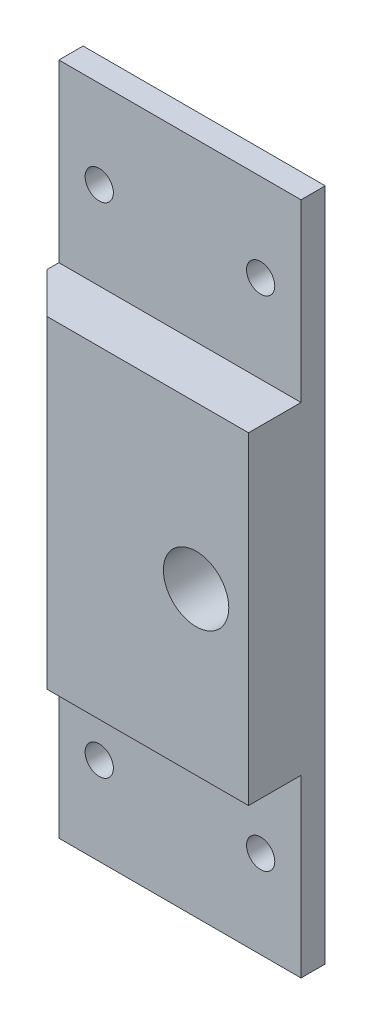
ISO-10303-21;
HEADER;
FILE_DESCRIPTION(('STEP AP214'),'2;1');
FILE_NAME('part.step','',(''),(''),'','','');
FILE_SCHEMA(('AUTOMOTIVE_DESIGN { 1 0 10303 214 1 1 1 1 }'));
ENDSEC;
DATA;
#1=APPLICATION_CONTEXT('core data for automotive mechanical design processes');
#2=APPLICATION_PROTOCOL_DEFINITION('international standard','automotive_design',2000,#1);
#3=PRODUCT_CONTEXT('',#1,'mechanical');
#4=PRODUCT('Part','Part','',(#3));
#5=PRODUCT_RELATED_PRODUCT_CATEGORY('part','',(#4));
#6=PRODUCT_DEFINITION_FORMATION('','',#4);
#7=PRODUCT_DEFINITION_CONTEXT('part definition',#1,'design');
#8=PRODUCT_DEFINITION('design','',#6,#7);
#9=PRODUCT_DEFINITION_SHAPE('','',#8);
#10=(LENGTH_UNIT() NAMED_UNIT(*) SI_UNIT(.MILLI.,.METRE.));
#11=(NAMED_UNIT(*) PLANE_ANGLE_UNIT() SI_UNIT($,.RADIAN.));
#12=(NAMED_UNIT(*) SI_UNIT($,.STERADIAN.) SOLID_ANGLE_UNIT());
#13=UNCERTAINTY_MEASURE_WITH_UNIT(LENGTH_MEASURE(1.E-05),#10,'distance_accuracy_value','');
#14=(GEOMETRIC_REPRESENTATION_CONTEXT(3) GLOBAL_UNCERTAINTY_ASSIGNED_CONTEXT((#13)) GLOBAL_UNIT_ASSIGNED_CONTEXT((#10,
#11,#12)) REPRESENTATION_CONTEXT('',''));
#15=CARTESIAN_POINT('',(0.,0.,0.));
#16=DIRECTION('',(0.,0.,1.));
#17=DIRECTION('',(1.,0.,0.));
#18=AXIS2_PLACEMENT_3D('',#15,#16,#17);
#19=CARTESIAN_POINT('',(0.,0.,3.));
#20=DIRECTION('',(0.,0.,-1.));
#21=DIRECTION('',(-1.,0.,0.));
#22=AXIS2_PLACEMENT_3D('',#19,#20,#21);
#23=PLANE('',#22);
#24=CARTESIAN_POINT('',(25.,72.625,3.));
#25=DIRECTION('',(0.,0.,-1.));
#26=DIRECTION('',(1.,0.,0.));
#27=AXIS2_PLACEMENT_3D('',#24,#25,#26);
#28=CIRCLE('',#27,1.75);
#29=CARTESIAN_POINT('',(26.75,72.625,3.));
#30=VERTEX_POINT('',#29);
#31=EDGE_CURVE('E186',#30,#30,#28,.T.);
#32=ORIENTED_EDGE('',*,*,#31,.T.);
#33=EDGE_LOOP('',(#32));
#34=FACE_BOUND('',#33,.T.);
#35=CARTESIAN_POINT('',(5.,72.625,3.));
#36=DIRECTION('',(0.,0.,-1.));
#37=DIRECTION('',(1.,0.,0.));
#38=AXIS2_PLACEMENT_3D('',#35,#36,#37);
#39=CIRCLE('',#38,1.75);
#40=CARTESIAN_POINT('',(6.75,72.625,3.));
#41=VERTEX_POINT('',#40);
#42=EDGE_CURVE('E182',#41,#41,#39,.T.);
#43=ORIENTED_EDGE('',*,*,#42,.T.);
#44=EDGE_LOOP('',(#43));
#45=FACE_BOUND('',#44,.T.);
#46=DIRECTION('',(-1.,0.,0.));
#47=VECTOR('',#46,1.);
#48=CARTESIAN_POINT('',(0.,61.75,3.));
#49=LINE('',#48,#47);
#50=CARTESIAN_POINT('',(30.,61.75,3.));
#51=VERTEX_POINT('',#50);
#52=CARTESIAN_POINT('',(0.,61.75,3.));
#53=VERTEX_POINT('',#52);
#54=EDGE_CURVE('E110',#51,#53,#49,.T.);
#55=ORIENTED_EDGE('',*,*,#54,.F.);
#56=DIRECTION('',(0.,1.,0.));
#57=VECTOR('',#56,1.);
#58=CARTESIAN_POINT('',(30.,0.,3.));
#59=LINE('',#58,#57);
#60=CARTESIAN_POINT('',(30.,83.5,3.));
#61=VERTEX_POINT('',#60);
#62=EDGE_CURVE('E147',#51,#61,#59,.T.);
#63=ORIENTED_EDGE('',*,*,#62,.T.);
#64=DIRECTION('',(-1.,0.,0.));
#65=VECTOR('',#64,1.);
#66=CARTESIAN_POINT('',(0.,83.5,3.));
#67=LINE('',#66,#65);
#68=CARTESIAN_POINT('',(0.,83.5,3.));
#69=VERTEX_POINT('',#68);
#70=EDGE_CURVE('E150',#61,#69,#67,.T.);
#71=ORIENTED_EDGE('',*,*,#70,.T.);
#72=DIRECTION('',(0.,-1.,0.));
#73=VECTOR('',#72,1.);
#74=CARTESIAN_POINT('',(0.,0.,3.));
#75=LINE('',#74,#73);
#76=EDGE_CURVE('E141',#69,#53,#75,.T.);
#77=ORIENTED_EDGE('',*,*,#76,.T.);
#78=EDGE_LOOP('',(#55,#63,#71,#77));
#79=FACE_BOUND('',#78,.T.);
#80=ADVANCED_FACE('F33',(#34,#45,#79),#23,.F.);
#81=CARTESIAN_POINT('',(25.,10.875,3.));
#82=DIRECTION('',(0.,0.,1.));
#83=DIRECTION('',(1.,0.,0.));
#84=AXIS2_PLACEMENT_3D('',#81,#82,#83);
#85=CIRCLE('',#84,1.75);
#86=CARTESIAN_POINT('',(26.75,10.875,3.));
#87=VERTEX_POINT('',#86);
#88=EDGE_CURVE('E178',#87,#87,#85,.T.);
#89=ORIENTED_EDGE('',*,*,#88,.F.);
#90=EDGE_LOOP('',(#89));
#91=FACE_BOUND('',#90,.T.);
#92=CARTESIAN_POINT('',(5.,10.875,3.));
#93=DIRECTION('',(0.,0.,1.));
#94=DIRECTION('',(1.,0.,0.));
#95=AXIS2_PLACEMENT_3D('',#92,#93,#94);
#96=CIRCLE('',#95,1.75);
#97=CARTESIAN_POINT('',(6.75,10.875,3.));
#98=VERTEX_POINT('',#97);
#99=EDGE_CURVE('E174',#98,#98,#96,.T.);
#100=ORIENTED_EDGE('',*,*,#99,.F.);
#101=EDGE_LOOP('',(#100));
#102=FACE_BOUND('',#101,.T.);
#103=DIRECTION('',(1.,0.,0.));
#104=VECTOR('',#103,1.);
#105=CARTESIAN_POINT('',(0.,21.75,3.));
#106=LINE('',#105,#104);
#107=CARTESIAN_POINT('',(0.,21.75,3.));
#108=VERTEX_POINT('',#107);
#109=CARTESIAN_POINT('',(30.,21.75,3.));
#110=VERTEX_POINT('',#109);
#111=EDGE_CURVE('E117',#108,#110,#106,.T.);
#112=ORIENTED_EDGE('',*,*,#111,.F.);
#113=CARTESIAN_POINT('',(0.,0.,3.));
#114=VERTEX_POINT('',#113);
#115=EDGE_CURVE('E145',#108,#114,#75,.T.);
#116=ORIENTED_EDGE('',*,*,#115,.T.);
#117=DIRECTION('',(1.,0.,0.));
#118=VECTOR('',#117,1.);
#119=CARTESIAN_POINT('',(0.,0.,3.));
#120=LINE('',#119,#118);
#121=CARTESIAN_POINT('',(30.,0.,3.));
#122=VERTEX_POINT('',#121);
#123=EDGE_CURVE('E144',#114,#122,#120,.T.);
#124=ORIENTED_EDGE('',*,*,#123,.T.);
#125=EDGE_CURVE('E148',#122,#110,#59,.T.);
#126=ORIENTED_EDGE('',*,*,#125,.T.);
#127=EDGE_LOOP('',(#112,#116,#124,#126));
#128=FACE_BOUND('',#127,.T.);
#129=ADVANCED_FACE('F208',(#91,#102,#128),#23,.F.);
#130=CARTESIAN_POINT('',(0.,0.,3.));
#131=DIRECTION('',(1.,0.,0.));
#132=DIRECTION('',(0.,0.,-1.));
#133=AXIS2_PLACEMENT_3D('',#130,#131,#132);
#134=PLANE('',#133);
#135=DIRECTION('',(0.,0.,-1.));
#136=VECTOR('',#135,1.);
#137=CARTESIAN_POINT('',(0.,21.75,9.5));
#138=LINE('',#137,#136);
#139=CARTESIAN_POINT('',(0.,21.75,4.49999999999997));
#140=VERTEX_POINT('',#139);
#141=EDGE_CURVE('E120',#140,#108,#138,.T.);
#142=ORIENTED_EDGE('',*,*,#141,.F.);
#143=DIRECTION('',(0.,1.,0.));
#144=VECTOR('',#143,1.);
#145=CARTESIAN_POINT('',(0.,61.75,4.49999999999997));
#146=LINE('',#145,#144);
#147=CARTESIAN_POINT('',(0.,61.75,4.49999999999997));
#148=VERTEX_POINT('',#147);
#149=EDGE_CURVE('E41',#140,#148,#146,.T.);
#150=ORIENTED_EDGE('',*,*,#149,.T.);
#151=DIRECTION('',(0.,0.,-1.));
#152=VECTOR('',#151,1.);
#153=CARTESIAN_POINT('',(0.,61.75,9.5));
#154=LINE('',#153,#152);
#155=EDGE_CURVE('E129',#148,#53,#154,.T.);
#156=ORIENTED_EDGE('',*,*,#155,.T.);
#157=ORIENTED_EDGE('',*,*,#76,.F.);
#158=DIRECTION('',(0.,0.,-1.));
#159=VECTOR('',#158,1.);
#160=CARTESIAN_POINT('',(0.,83.5,3.));
#161=LINE('',#160,#159);
#162=CARTESIAN_POINT('',(0.,83.5,0.));
#163=VERTEX_POINT('',#162);
#164=EDGE_CURVE('E152',#69,#163,#161,.T.);
#165=ORIENTED_EDGE('',*,*,#164,.T.);
#166=DIRECTION('',(0.,-1.,0.));
#167=VECTOR('',#166,1.);
#168=CARTESIAN_POINT('',(0.,0.,0.));
#169=LINE('',#168,#167);
#170=CARTESIAN_POINT('',(0.,0.,0.));
#171=VERTEX_POINT('',#170);
#172=EDGE_CURVE('E140',#163,#171,#169,.T.);
#173=ORIENTED_EDGE('',*,*,#172,.T.);
#174=DIRECTION('',(0.,0.,-1.));
#175=VECTOR('',#174,1.);
#176=CARTESIAN_POINT('',(0.,0.,3.));
#177=LINE('',#176,#175);
#178=EDGE_CURVE('E169',#114,#171,#177,.T.);
#179=ORIENTED_EDGE('',*,*,#178,.F.);
#180=ORIENTED_EDGE('',*,*,#115,.F.);
#181=EDGE_LOOP('',(#142,#150,#156,#157,#165,#173,#179,#180));
#182=FACE_BOUND('',#181,.T.);
#183=ADVANCED_FACE('F211',(#182),#134,.F.);
#184=CARTESIAN_POINT('',(0.,0.,3.));
#185=DIRECTION('',(0.,1.,0.));
#186=DIRECTION('',(0.,0.,1.));
#187=AXIS2_PLACEMENT_3D('',#184,#185,#186);
#188=PLANE('',#187);
#189=DIRECTION('',(1.,0.,0.));
#190=VECTOR('',#189,1.);
#191=CARTESIAN_POINT('',(0.,0.,0.));
#192=LINE('',#191,#190);
#193=CARTESIAN_POINT('',(30.,0.,0.));
#194=VERTEX_POINT('',#193);
#195=EDGE_CURVE('E155',#171,#194,#192,.T.);
#196=ORIENTED_EDGE('',*,*,#195,.T.);
#197=DIRECTION('',(0.,0.,-1.));
#198=VECTOR('',#197,1.);
#199=CARTESIAN_POINT('',(30.,0.,3.));
#200=LINE('',#199,#198);
#201=EDGE_CURVE('E166',#122,#194,#200,.T.);
#202=ORIENTED_EDGE('',*,*,#201,.F.);
#203=ORIENTED_EDGE('',*,*,#123,.F.);
#204=ORIENTED_EDGE('',*,*,#178,.T.);
#205=EDGE_LOOP('',(#196,#202,#203,#204));
#206=FACE_BOUND('',#205,.T.);
#207=ADVANCED_FACE('F219',(#206),#188,.F.);
#208=CARTESIAN_POINT('',(30.,0.,3.));
#209=DIRECTION('',(-1.,0.,0.));
#210=DIRECTION('',(0.,0.,1.));
#211=AXIS2_PLACEMENT_3D('',#208,#209,#210);
#212=PLANE('',#211);
#213=DIRECTION('',(0.,1.,0.));
#214=VECTOR('',#213,1.);
#215=CARTESIAN_POINT('',(30.,0.,0.));
#216=LINE('',#215,#214);
#217=CARTESIAN_POINT('',(30.,83.5,0.));
#218=VERTEX_POINT('',#217);
#219=EDGE_CURVE('E157',#194,#218,#216,.T.);
#220=ORIENTED_EDGE('',*,*,#219,.T.);
#221=DIRECTION('',(0.,0.,-1.));
#222=VECTOR('',#221,1.);
#223=CARTESIAN_POINT('',(30.,83.5,3.));
#224=LINE('',#223,#222);
#225=EDGE_CURVE('E163',#61,#218,#224,.T.);
#226=ORIENTED_EDGE('',*,*,#225,.F.);
#227=ORIENTED_EDGE('',*,*,#62,.F.);
#228=DIRECTION('',(0.,0.,-1.));
#229=VECTOR('',#228,1.);
#230=CARTESIAN_POINT('',(30.,61.75,9.5));
#231=LINE('',#230,#229);
#232=CARTESIAN_POINT('',(30.,61.75,9.5));
#233=VERTEX_POINT('',#232);
#234=EDGE_CURVE('E121',#233,#51,#231,.T.);
#235=ORIENTED_EDGE('',*,*,#234,.F.);
#236=DIRECTION('',(0.,1.,0.));
#237=VECTOR('',#236,1.);
#238=CARTESIAN_POINT('',(30.,61.75,9.5));
#239=LINE('',#238,#237);
#240=CARTESIAN_POINT('',(30.,21.75,9.5));
#241=VERTEX_POINT('',#240);
#242=EDGE_CURVE('E106',#241,#233,#239,.T.);
#243=ORIENTED_EDGE('',*,*,#242,.F.);
#244=DIRECTION('',(0.,0.,-1.));
#245=VECTOR('',#244,1.);
#246=CARTESIAN_POINT('',(30.,21.75,9.5));
#247=LINE('',#246,#245);
#248=EDGE_CURVE('E114',#241,#110,#247,.T.);
#249=ORIENTED_EDGE('',*,*,#248,.T.);
#250=ORIENTED_EDGE('',*,*,#125,.F.);
#251=ORIENTED_EDGE('',*,*,#201,.T.);
#252=EDGE_LOOP('',(#220,#226,#227,#235,#243,#249,#250,#251));
#253=FACE_BOUND('',#252,.T.);
#254=ADVANCED_FACE('F123',(#253),#212,.F.);
#255=CARTESIAN_POINT('',(0.,83.5,3.));
#256=DIRECTION('',(0.,-1.,0.));
#257=DIRECTION('',(0.,0.,-1.));
#258=AXIS2_PLACEMENT_3D('',#255,#256,#257);
#259=PLANE('',#258);
#260=DIRECTION('',(-1.,0.,0.));
#261=VECTOR('',#260,1.);
#262=CARTESIAN_POINT('',(0.,83.5,0.));
#263=LINE('',#262,#261);
#264=EDGE_CURVE('E159',#218,#163,#263,.T.);
#265=ORIENTED_EDGE('',*,*,#264,.T.);
#266=ORIENTED_EDGE('',*,*,#164,.F.);
#267=ORIENTED_EDGE('',*,*,#70,.F.);
#268=ORIENTED_EDGE('',*,*,#225,.T.);
#269=EDGE_LOOP('',(#265,#266,#267,#268));
#270=FACE_BOUND('',#269,.T.);
#271=ADVANCED_FACE('F228',(#270),#259,.F.);
#272=CARTESIAN_POINT('',(0.,0.,0.));
#273=DIRECTION('',(0.,0.,-1.));
#274=DIRECTION('',(-1.,0.,0.));
#275=AXIS2_PLACEMENT_3D('',#272,#273,#274);
#276=PLANE('',#275);
#277=CARTESIAN_POINT('',(23.5,41.75,0.));
#278=DIRECTION('',(0.,0.,-1.));
#279=DIRECTION('',(-1.,0.,0.));
#280=AXIS2_PLACEMENT_3D('',#277,#278,#279);
#281=CIRCLE('',#280,4.05);
#282=CARTESIAN_POINT('',(27.55,41.75,0.));
#283=VERTEX_POINT('',#282);
#284=EDGE_CURVE('E193',#283,#283,#281,.T.);
#285=ORIENTED_EDGE('',*,*,#284,.F.);
#286=EDGE_LOOP('',(#285));
#287=FACE_BOUND('',#286,.T.);
#288=CARTESIAN_POINT('',(25.,72.625,0.));
#289=DIRECTION('',(0.,0.,-1.));
#290=DIRECTION('',(-1.,0.,0.));
#291=AXIS2_PLACEMENT_3D('',#288,#289,#290);
#292=CIRCLE('',#291,1.75);
#293=CARTESIAN_POINT('',(23.25,72.625,0.));
#294=VERTEX_POINT('',#293);
#295=EDGE_CURVE('E183',#294,#294,#292,.F.);
#296=ORIENTED_EDGE('',*,*,#295,.T.);
#297=EDGE_LOOP('',(#296));
#298=FACE_BOUND('',#297,.T.);
#299=CARTESIAN_POINT('',(5.,72.625,0.));
#300=DIRECTION('',(0.,0.,-1.));
#301=DIRECTION('',(-1.,0.,0.));
#302=AXIS2_PLACEMENT_3D('',#299,#300,#301);
#303=CIRCLE('',#302,1.75);
#304=CARTESIAN_POINT('',(3.25,72.625,0.));
#305=VERTEX_POINT('',#304);
#306=EDGE_CURVE('E179',#305,#305,#303,.F.);
#307=ORIENTED_EDGE('',*,*,#306,.T.);
#308=EDGE_LOOP('',(#307));
#309=FACE_BOUND('',#308,.T.);
#310=CARTESIAN_POINT('',(25.,10.875,0.));
#311=DIRECTION('',(0.,0.,-1.));
#312=DIRECTION('',(-1.,0.,0.));
#313=AXIS2_PLACEMENT_3D('',#310,#311,#312);
#314=CIRCLE('',#313,1.75);
#315=CARTESIAN_POINT('',(23.25,10.875,0.));
#316=VERTEX_POINT('',#315);
#317=EDGE_CURVE('E175',#316,#316,#314,.T.);
#318=ORIENTED_EDGE('',*,*,#317,.F.);
#319=EDGE_LOOP('',(#318));
#320=FACE_BOUND('',#319,.T.);
#321=CARTESIAN_POINT('',(5.,10.875,0.));
#322=DIRECTION('',(0.,0.,-1.));
#323=DIRECTION('',(-1.,0.,0.));
#324=AXIS2_PLACEMENT_3D('',#321,#322,#323);
#325=CIRCLE('',#324,1.75);
#326=CARTESIAN_POINT('',(3.25,10.875,0.));
#327=VERTEX_POINT('',#326);
#328=EDGE_CURVE('E134',#327,#327,#325,.T.);
#329=ORIENTED_EDGE('',*,*,#328,.F.);
#330=EDGE_LOOP('',(#329));
#331=FACE_BOUND('',#330,.T.);
#332=ORIENTED_EDGE('',*,*,#172,.F.);
#333=ORIENTED_EDGE('',*,*,#264,.F.);
#334=ORIENTED_EDGE('',*,*,#219,.F.);
#335=ORIENTED_EDGE('',*,*,#195,.F.);
#336=EDGE_LOOP('',(#332,#333,#334,#335));
#337=FACE_BOUND('',#336,.T.);
#338=ADVANCED_FACE('F225',(#287,#298,#309,#320,#331,#337),#276,.T.);
#339=CARTESIAN_POINT('',(0.,21.75,9.5));
#340=DIRECTION('',(0.,1.,0.));
#341=DIRECTION('',(0.,0.,1.));
#342=AXIS2_PLACEMENT_3D('',#339,#340,#341);
#343=PLANE('',#342);
#344=DIRECTION('',(1.,0.,0.));
#345=VECTOR('',#344,1.);
#346=CARTESIAN_POINT('',(0.,21.75,9.5));
#347=LINE('',#346,#345);
#348=CARTESIAN_POINT('',(5.00000000000002,21.75,9.5));
#349=VERTEX_POINT('',#348);
#350=EDGE_CURVE('E101',#349,#241,#347,.T.);
#351=ORIENTED_EDGE('',*,*,#350,.F.);
#352=DIRECTION('',(-0.707106781186546,0.,-0.707106781186548));
#353=VECTOR('',#352,1.);
#354=CARTESIAN_POINT('',(5.00000000000002,21.75,9.5));
#355=LINE('',#354,#353);
#356=EDGE_CURVE('E55',#349,#140,#355,.T.);
#357=ORIENTED_EDGE('',*,*,#356,.T.);
#358=ORIENTED_EDGE('',*,*,#141,.T.);
#359=ORIENTED_EDGE('',*,*,#111,.T.);
#360=ORIENTED_EDGE('',*,*,#248,.F.);
#361=EDGE_LOOP('',(#351,#357,#358,#359,#360));
#362=FACE_BOUND('',#361,.T.);
#363=ADVANCED_FACE('F115',(#362),#343,.F.);
#364=CARTESIAN_POINT('',(0.,61.75,9.5));
#365=DIRECTION('',(0.,-1.,0.));
#366=DIRECTION('',(0.,0.,-1.));
#367=AXIS2_PLACEMENT_3D('',#364,#365,#366);
#368=PLANE('',#367);
#369=ORIENTED_EDGE('',*,*,#155,.F.);
#370=DIRECTION('',(0.707106781186546,0.,0.707106781186548));
#371=VECTOR('',#370,1.);
#372=CARTESIAN_POINT('',(5.00000000000002,61.75,9.5));
#373=LINE('',#372,#371);
#374=CARTESIAN_POINT('',(5.00000000000002,61.75,9.5));
#375=VERTEX_POINT('',#374);
#376=EDGE_CURVE('E11',#148,#375,#373,.T.);
#377=ORIENTED_EDGE('',*,*,#376,.T.);
#378=DIRECTION('',(-1.,0.,0.));
#379=VECTOR('',#378,1.);
#380=CARTESIAN_POINT('',(0.,61.75,9.5));
#381=LINE('',#380,#379);
#382=EDGE_CURVE('E127',#233,#375,#381,.T.);
#383=ORIENTED_EDGE('',*,*,#382,.F.);
#384=ORIENTED_EDGE('',*,*,#234,.T.);
#385=ORIENTED_EDGE('',*,*,#54,.T.);
#386=EDGE_LOOP('',(#369,#377,#383,#384,#385));
#387=FACE_BOUND('',#386,.T.);
#388=ADVANCED_FACE('F233',(#387),#368,.F.);
#389=CARTESIAN_POINT('',(0.,0.,9.5));
#390=DIRECTION('',(0.,0.,1.));
#391=DIRECTION('',(1.,0.,0.));
#392=AXIS2_PLACEMENT_3D('',#389,#390,#391);
#393=PLANE('',#392);
#394=CARTESIAN_POINT('',(23.5,41.75,9.5));
#395=DIRECTION('',(0.,0.,1.));
#396=DIRECTION('',(1.,0.,0.));
#397=AXIS2_PLACEMENT_3D('',#394,#395,#396);
#398=CIRCLE('',#397,4.05);
#399=CARTESIAN_POINT('',(27.55,41.75,9.5));
#400=VERTEX_POINT('',#399);
#401=EDGE_CURVE('E198',#400,#400,#398,.T.);
#402=ORIENTED_EDGE('',*,*,#401,.F.);
#403=EDGE_LOOP('',(#402));
#404=FACE_BOUND('',#403,.T.);
#405=ORIENTED_EDGE('',*,*,#382,.T.);
#406=DIRECTION('',(0.,-1.,0.));
#407=VECTOR('',#406,1.);
#408=CARTESIAN_POINT('',(5.00000000000002,21.75,9.5));
#409=LINE('',#408,#407);
#410=EDGE_CURVE('E109',#375,#349,#409,.T.);
#411=ORIENTED_EDGE('',*,*,#410,.T.);
#412=ORIENTED_EDGE('',*,*,#350,.T.);
#413=ORIENTED_EDGE('',*,*,#242,.T.);
#414=EDGE_LOOP('',(#405,#411,#412,#413));
#415=FACE_BOUND('',#414,.T.);
#416=ADVANCED_FACE('F104',(#404,#415),#393,.T.);
#417=CARTESIAN_POINT('',(5.,10.875,-4.));
#418=DIRECTION('',(0.,0.,1.));
#419=DIRECTION('',(1.,0.,0.));
#420=AXIS2_PLACEMENT_3D('',#417,#418,#419);
#421=CYLINDRICAL_SURFACE('',#420,1.75);
#422=ORIENTED_EDGE('',*,*,#328,.T.);
#423=EDGE_LOOP('',(#422));
#424=FACE_BOUND('',#423,.T.);
#425=ORIENTED_EDGE('',*,*,#99,.T.);
#426=EDGE_LOOP('',(#425));
#427=FACE_BOUND('',#426,.T.);
#428=ADVANCED_FACE('F206',(#424,#427),#421,.F.);
#429=CARTESIAN_POINT('',(25.,10.875,-4.));
#430=DIRECTION('',(0.,0.,1.));
#431=DIRECTION('',(1.,0.,0.));
#432=AXIS2_PLACEMENT_3D('',#429,#430,#431);
#433=CYLINDRICAL_SURFACE('',#432,1.75);
#434=ORIENTED_EDGE('',*,*,#317,.T.);
#435=EDGE_LOOP('',(#434));
#436=FACE_BOUND('',#435,.T.);
#437=ORIENTED_EDGE('',*,*,#88,.T.);
#438=EDGE_LOOP('',(#437));
#439=FACE_BOUND('',#438,.T.);
#440=ADVANCED_FACE('F305',(#436,#439),#433,.F.);
#441=CARTESIAN_POINT('',(5.,72.625,-4.));
#442=DIRECTION('',(0.,0.,1.));
#443=DIRECTION('',(1.,0.,0.));
#444=AXIS2_PLACEMENT_3D('',#441,#442,#443);
#445=CYLINDRICAL_SURFACE('',#444,1.75);
#446=ORIENTED_EDGE('',*,*,#306,.F.);
#447=EDGE_LOOP('',(#446));
#448=FACE_BOUND('',#447,.T.);
#449=ORIENTED_EDGE('',*,*,#42,.F.);
#450=EDGE_LOOP('',(#449));
#451=FACE_BOUND('',#450,.T.);
#452=ADVANCED_FACE('F313',(#448,#451),#445,.F.);
#453=CARTESIAN_POINT('',(25.,72.625,-4.));
#454=DIRECTION('',(0.,0.,1.));
#455=DIRECTION('',(1.,0.,0.));
#456=AXIS2_PLACEMENT_3D('',#453,#454,#455);
#457=CYLINDRICAL_SURFACE('',#456,1.75);
#458=ORIENTED_EDGE('',*,*,#295,.F.);
#459=EDGE_LOOP('',(#458));
#460=FACE_BOUND('',#459,.T.);
#461=ORIENTED_EDGE('',*,*,#31,.F.);
#462=EDGE_LOOP('',(#461));
#463=FACE_BOUND('',#462,.T.);
#464=ADVANCED_FACE('F241',(#460,#463),#457,.F.);
#465=CARTESIAN_POINT('',(23.5,41.75,-14.5));
#466=DIRECTION('',(0.,0.,1.));
#467=DIRECTION('',(1.,0.,0.));
#468=AXIS2_PLACEMENT_3D('',#465,#466,#467);
#469=CYLINDRICAL_SURFACE('',#468,4.05);
#470=CARTESIAN_POINT('',(27.55,41.75,0.));
#471=CARTESIAN_POINT('',(27.55,41.75,0.0989583333333334));
#472=CARTESIAN_POINT('',(27.55,41.75,0.197916666666667));
#473=CARTESIAN_POINT('',(27.55,41.75,0.395833333333334));
#474=CARTESIAN_POINT('',(27.55,41.75,0.494791666666667));
#475=CARTESIAN_POINT('',(27.55,41.75,0.692708333333334));
#476=CARTESIAN_POINT('',(27.55,41.75,0.791666666666667));
#477=CARTESIAN_POINT('',(27.55,41.75,0.989583333333334));
#478=CARTESIAN_POINT('',(27.55,41.75,1.08854166666667));
#479=CARTESIAN_POINT('',(27.55,41.75,1.28645833333333));
#480=CARTESIAN_POINT('',(27.55,41.75,1.38541666666666));
#481=CARTESIAN_POINT('',(27.55,41.75,1.58333333333333));
#482=CARTESIAN_POINT('',(27.55,41.75,1.68229166666667));
#483=CARTESIAN_POINT('',(27.55,41.75,1.88020833333333));
#484=CARTESIAN_POINT('',(27.55,41.75,1.97916666666667));
#485=CARTESIAN_POINT('',(27.55,41.75,2.17708333333333));
#486=CARTESIAN_POINT('',(27.55,41.75,2.27604166666667));
#487=CARTESIAN_POINT('',(27.55,41.75,2.47395833333333));
#488=CARTESIAN_POINT('',(27.55,41.75,2.57291666666667));
#489=CARTESIAN_POINT('',(27.55,41.75,2.77083333333333));
#490=CARTESIAN_POINT('',(27.55,41.75,2.86979166666666));
#491=CARTESIAN_POINT('',(27.55,41.75,3.06770833333333));
#492=CARTESIAN_POINT('',(27.55,41.75,3.16666666666667));
#493=CARTESIAN_POINT('',(27.55,41.75,3.36458333333333));
#494=CARTESIAN_POINT('',(27.55,41.75,3.46354166666667));
#495=CARTESIAN_POINT('',(27.55,41.75,3.66145833333333));
#496=CARTESIAN_POINT('',(27.55,41.75,3.76041666666667));
#497=CARTESIAN_POINT('',(27.55,41.75,3.95833333333333));
#498=CARTESIAN_POINT('',(27.55,41.75,4.05729166666667));
#499=CARTESIAN_POINT('',(27.55,41.75,4.25520833333333));
#500=CARTESIAN_POINT('',(27.55,41.75,4.35416666666667));
#501=CARTESIAN_POINT('',(27.55,41.75,4.55208333333333));
#502=CARTESIAN_POINT('',(27.55,41.75,4.65104166666667));
#503=CARTESIAN_POINT('',(27.55,41.75,4.84895833333333));
#504=CARTESIAN_POINT('',(27.55,41.75,4.94791666666666));
#505=CARTESIAN_POINT('',(27.55,41.75,5.14583333333333));
#506=CARTESIAN_POINT('',(27.55,41.75,5.24479166666667));
#507=CARTESIAN_POINT('',(27.55,41.75,5.44270833333333));
#508=CARTESIAN_POINT('',(27.55,41.75,5.54166666666667));
#509=CARTESIAN_POINT('',(27.55,41.75,5.73958333333333));
#510=CARTESIAN_POINT('',(27.55,41.75,5.83854166666667));
#511=CARTESIAN_POINT('',(27.55,41.75,6.03645833333333));
#512=CARTESIAN_POINT('',(27.55,41.75,6.13541666666667));
#513=CARTESIAN_POINT('',(27.55,41.75,6.33333333333333));
#514=CARTESIAN_POINT('',(27.55,41.75,6.43229166666667));
#515=CARTESIAN_POINT('',(27.55,41.75,6.63020833333333));
#516=CARTESIAN_POINT('',(27.55,41.75,6.72916666666667));
#517=CARTESIAN_POINT('',(27.55,41.75,6.92708333333333));
#518=CARTESIAN_POINT('',(27.55,41.75,7.02604166666667));
#519=CARTESIAN_POINT('',(27.55,41.75,7.22395833333333));
#520=CARTESIAN_POINT('',(27.55,41.75,7.32291666666667));
#521=CARTESIAN_POINT('',(27.55,41.75,7.52083333333333));
#522=CARTESIAN_POINT('',(27.55,41.75,7.61979166666667));
#523=CARTESIAN_POINT('',(27.55,41.75,7.81770833333333));
#524=CARTESIAN_POINT('',(27.55,41.75,7.91666666666667));
#525=CARTESIAN_POINT('',(27.55,41.75,8.11458333333333));
#526=CARTESIAN_POINT('',(27.55,41.75,8.21354166666667));
#527=CARTESIAN_POINT('',(27.55,41.75,8.41145833333333));
#528=CARTESIAN_POINT('',(27.55,41.75,8.51041666666667));
#529=CARTESIAN_POINT('',(27.55,41.75,8.70833333333333));
#530=CARTESIAN_POINT('',(27.55,41.75,8.80729166666667));
#531=CARTESIAN_POINT('',(27.55,41.75,9.00520833333333));
#532=CARTESIAN_POINT('',(27.55,41.75,9.10416666666666));
#533=CARTESIAN_POINT('',(27.55,41.75,9.30208333333333));
#534=CARTESIAN_POINT('',(27.55,41.75,9.40104166666666));
#535=CARTESIAN_POINT('',(27.55,41.75,9.5));
#536=B_SPLINE_CURVE_WITH_KNOTS('',3,(#470,#471,#472,#473,#474,#475,#476,#477,#478,#479,#480,
#481,#482,#483,#484,#485,#486,#487,#488,#489,#490,#491,#492,#493,#494,#495,#496,#497,#498,#499,
#500,#501,#502,#503,#504,#505,#506,#507,#508,#509,#510,#511,#512,#513,#514,#515,#516,#517,#518,
#519,#520,#521,#522,#523,#524,#525,#526,#527,#528,#529,#530,#531,#532,#533,#534,#535),
.UNSPECIFIED.,.F.,.F.,(4,2,2,2,2,2,2,2,2,2,2,2,2,2,2,2,2,2,2,2,2,2,2,2,2,2,2,2,2,2,2,2,4),(0.,
0.296875,0.593750000000001,0.890625000000001,1.1875,1.484375,1.78125,2.078125,2.375,2.671875,
2.96875,3.265625,3.5625,3.859375,4.15625,4.453125,4.75,5.046875,5.34375,5.640625,5.9375,
6.234375,6.53125,6.828125,7.125,7.421875,7.71875,8.015625,8.3125,8.609375,8.90625,9.203125,9.5),.UNSPECIFIED.);
#537=EDGE_CURVE('BSEAM237',#283,#400,#536,.T.);
#538=ORIENTED_EDGE('',*,*,#284,.T.);
#539=ORIENTED_EDGE('',*,*,#401,.T.);
#540=ORIENTED_EDGE('',*,*,#537,.T.);
#541=ORIENTED_EDGE('',*,*,#537,.F.);
#542=EDGE_LOOP('',(#538,#540,#539,#541));
#543=FACE_BOUND('',#542,.T.);
#544=ADVANCED_FACE('F237',(#543),#469,.F.);
#545=CARTESIAN_POINT('',(5.00000000000002,0.,9.5));
#546=DIRECTION('',(-0.707106781186548,0.,0.707106781186546));
#547=DIRECTION('',(0.,1.,0.));
#548=AXIS2_PLACEMENT_3D('',#545,#546,#547);
#549=PLANE('',#548);
#550=ORIENTED_EDGE('',*,*,#376,.F.);
#551=ORIENTED_EDGE('',*,*,#149,.F.);
#552=ORIENTED_EDGE('',*,*,#356,.F.);
#553=ORIENTED_EDGE('',*,*,#410,.F.);
#554=EDGE_LOOP('',(#550,#551,#552,#553));
#555=FACE_BOUND('',#554,.T.);
#556=ADVANCED_FACE('F35',(#555),#549,.T.);
#557=CLOSED_SHELL('',(#80,#129,#183,#207,#254,#271,#338,#363,#388,#416,#428,#440,#452,#464,#544,#556));
#558=MANIFOLD_SOLID_BREP('B2',#557);
#559=ADVANCED_BREP_SHAPE_REPRESENTATION('',(#18,#558),#14);
#560=SHAPE_DEFINITION_REPRESENTATION(#9,#559);
ENDSEC;
END-ISO-10303-21;
